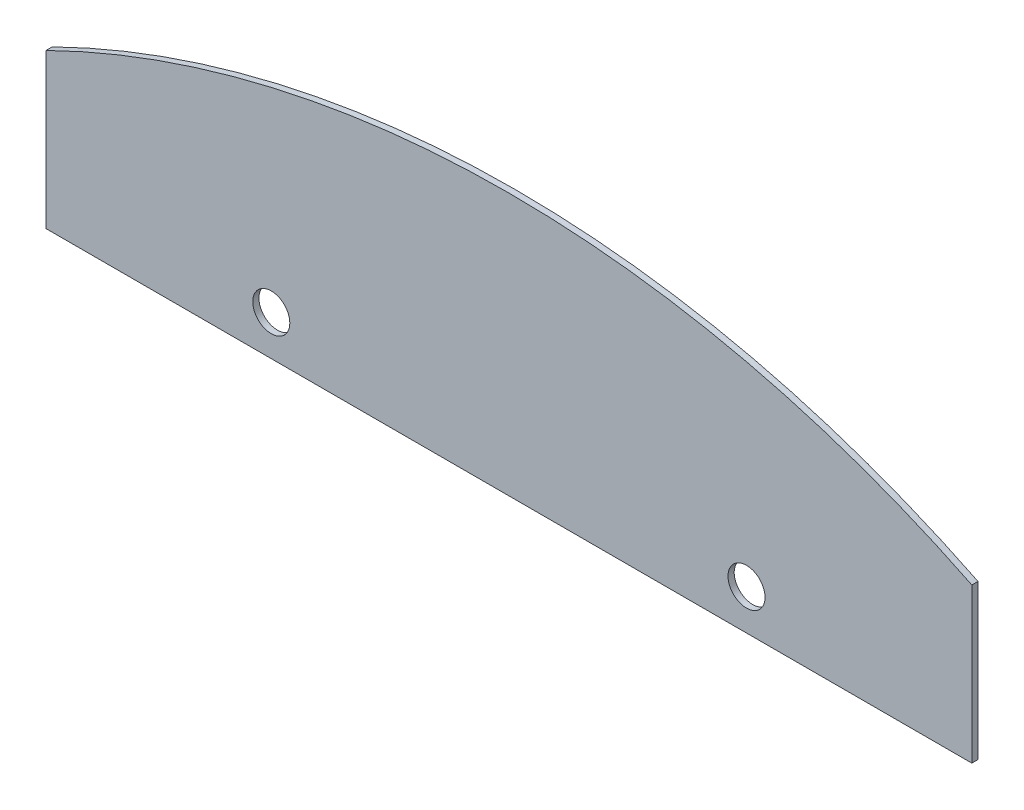
ISO-10303-21;
HEADER;
FILE_DESCRIPTION(('STEP AP214'),'2;1');
FILE_NAME('part.step','',(''),(''),'','','');
FILE_SCHEMA(('AUTOMOTIVE_DESIGN { 1 0 10303 214 1 1 1 1 }'));
ENDSEC;
DATA;
#1=APPLICATION_CONTEXT('core data for automotive mechanical design processes');
#2=APPLICATION_PROTOCOL_DEFINITION('international standard','automotive_design',2000,#1);
#3=PRODUCT_CONTEXT('',#1,'mechanical');
#4=PRODUCT('Part','Part','',(#3));
#5=PRODUCT_RELATED_PRODUCT_CATEGORY('part','',(#4));
#6=PRODUCT_DEFINITION_FORMATION('','',#4);
#7=PRODUCT_DEFINITION_CONTEXT('part definition',#1,'design');
#8=PRODUCT_DEFINITION('design','',#6,#7);
#9=PRODUCT_DEFINITION_SHAPE('','',#8);
#10=(LENGTH_UNIT() NAMED_UNIT(*) SI_UNIT(.MILLI.,.METRE.));
#11=(NAMED_UNIT(*) PLANE_ANGLE_UNIT() SI_UNIT($,.RADIAN.));
#12=(NAMED_UNIT(*) SI_UNIT($,.STERADIAN.) SOLID_ANGLE_UNIT());
#13=UNCERTAINTY_MEASURE_WITH_UNIT(LENGTH_MEASURE(1.E-05),#10,'distance_accuracy_value','');
#14=(GEOMETRIC_REPRESENTATION_CONTEXT(3) GLOBAL_UNCERTAINTY_ASSIGNED_CONTEXT((#13)) GLOBAL_UNIT_ASSIGNED_CONTEXT((#10,
#11,#12)) REPRESENTATION_CONTEXT('',''));
#15=CARTESIAN_POINT('',(0.,0.,0.));
#16=DIRECTION('',(0.,0.,1.));
#17=DIRECTION('',(1.,0.,0.));
#18=AXIS2_PLACEMENT_3D('',#15,#16,#17);
#19=CARTESIAN_POINT('',(-150.,0.,2.));
#20=DIRECTION('',(1.,0.,0.));
#21=DIRECTION('',(0.,0.,-1.));
#22=AXIS2_PLACEMENT_3D('',#19,#20,#21);
#23=PLANE('',#22);
#24=DIRECTION('',(0.,-1.,0.));
#25=VECTOR('',#24,1.);
#26=CARTESIAN_POINT('',(-150.,0.,0.));
#27=LINE('',#26,#25);
#28=CARTESIAN_POINT('',(-150.,49.9999999999999,0.));
#29=VERTEX_POINT('',#28);
#30=CARTESIAN_POINT('',(-150.,0.,0.));
#31=VERTEX_POINT('',#30);
#32=EDGE_CURVE('E113',#29,#31,#27,.T.);
#33=ORIENTED_EDGE('',*,*,#32,.T.);
#34=DIRECTION('',(0.,0.,-1.));
#35=VECTOR('',#34,1.);
#36=CARTESIAN_POINT('',(-150.,0.,2.));
#37=LINE('',#36,#35);
#38=CARTESIAN_POINT('',(-150.,0.,2.));
#39=VERTEX_POINT('',#38);
#40=EDGE_CURVE('E11',#39,#31,#37,.T.);
#41=ORIENTED_EDGE('',*,*,#40,.F.);
#42=DIRECTION('',(0.,-1.,0.));
#43=VECTOR('',#42,1.);
#44=CARTESIAN_POINT('',(-150.,0.,2.));
#45=LINE('',#44,#43);
#46=CARTESIAN_POINT('',(-150.,49.9999999999999,2.));
#47=VERTEX_POINT('',#46);
#48=EDGE_CURVE('E97',#47,#39,#45,.T.);
#49=ORIENTED_EDGE('',*,*,#48,.F.);
#50=DIRECTION('',(0.,0.,-1.));
#51=VECTOR('',#50,1.);
#52=CARTESIAN_POINT('',(-150.,49.9999999999999,2.));
#53=LINE('',#52,#51);
#54=EDGE_CURVE('E109',#47,#29,#53,.T.);
#55=ORIENTED_EDGE('',*,*,#54,.T.);
#56=EDGE_LOOP('',(#33,#41,#49,#55));
#57=FACE_BOUND('',#56,.T.);
#58=ADVANCED_FACE('F45',(#57),#23,.F.);
#59=CARTESIAN_POINT('',(-150.,0.,2.));
#60=DIRECTION('',(0.,1.,0.));
#61=DIRECTION('',(0.,0.,1.));
#62=AXIS2_PLACEMENT_3D('',#59,#60,#61);
#63=PLANE('',#62);
#64=DIRECTION('',(1.,0.,0.));
#65=VECTOR('',#64,1.);
#66=CARTESIAN_POINT('',(-150.,0.,0.));
#67=LINE('',#66,#65);
#68=CARTESIAN_POINT('',(150.,0.,0.));
#69=VERTEX_POINT('',#68);
#70=EDGE_CURVE('E102',#31,#69,#67,.T.);
#71=ORIENTED_EDGE('',*,*,#70,.T.);
#72=DIRECTION('',(0.,0.,-1.));
#73=VECTOR('',#72,1.);
#74=CARTESIAN_POINT('',(150.,0.,2.));
#75=LINE('',#74,#73);
#76=CARTESIAN_POINT('',(150.,0.,2.));
#77=VERTEX_POINT('',#76);
#78=EDGE_CURVE('E54',#77,#69,#75,.T.);
#79=ORIENTED_EDGE('',*,*,#78,.F.);
#80=DIRECTION('',(1.,0.,0.));
#81=VECTOR('',#80,1.);
#82=CARTESIAN_POINT('',(-150.,0.,2.));
#83=LINE('',#82,#81);
#84=EDGE_CURVE('E92',#39,#77,#83,.T.);
#85=ORIENTED_EDGE('',*,*,#84,.F.);
#86=ORIENTED_EDGE('',*,*,#40,.T.);
#87=EDGE_LOOP('',(#71,#79,#85,#86));
#88=FACE_BOUND('',#87,.T.);
#89=ADVANCED_FACE('F101',(#88),#63,.F.);
#90=CARTESIAN_POINT('',(150.,0.,2.));
#91=DIRECTION('',(-1.,0.,0.));
#92=DIRECTION('',(0.,0.,1.));
#93=AXIS2_PLACEMENT_3D('',#90,#91,#92);
#94=PLANE('',#93);
#95=DIRECTION('',(0.,1.,0.));
#96=VECTOR('',#95,1.);
#97=CARTESIAN_POINT('',(150.,0.,0.));
#98=LINE('',#97,#96);
#99=CARTESIAN_POINT('',(150.,50.,0.));
#100=VERTEX_POINT('',#99);
#101=EDGE_CURVE('E79',#69,#100,#98,.T.);
#102=ORIENTED_EDGE('',*,*,#101,.T.);
#103=DIRECTION('',(0.,0.,-1.));
#104=VECTOR('',#103,1.);
#105=CARTESIAN_POINT('',(150.,50.,2.));
#106=LINE('',#105,#104);
#107=CARTESIAN_POINT('',(150.,50.,2.));
#108=VERTEX_POINT('',#107);
#109=EDGE_CURVE('E104',#108,#100,#106,.T.);
#110=ORIENTED_EDGE('',*,*,#109,.F.);
#111=DIRECTION('',(0.,1.,0.));
#112=VECTOR('',#111,1.);
#113=CARTESIAN_POINT('',(150.,0.,2.));
#114=LINE('',#113,#112);
#115=EDGE_CURVE('E95',#77,#108,#114,.T.);
#116=ORIENTED_EDGE('',*,*,#115,.F.);
#117=ORIENTED_EDGE('',*,*,#78,.T.);
#118=EDGE_LOOP('',(#102,#110,#116,#117));
#119=FACE_BOUND('',#118,.T.);
#120=ADVANCED_FACE('F105',(#119),#94,.F.);
#121=CARTESIAN_POINT('',(0.,-253.928571428571,2.));
#122=DIRECTION('',(0.,0.,-1.));
#123=DIRECTION('',(-1.,0.,0.));
#124=AXIS2_PLACEMENT_3D('',#121,#122,#123);
#125=CYLINDRICAL_SURFACE('',#124,338.928571428571);
#126=CARTESIAN_POINT('',(0.,-253.928571428571,0.));
#127=DIRECTION('',(0.,0.,1.));
#128=DIRECTION('',(1.,0.,0.));
#129=AXIS2_PLACEMENT_3D('',#126,#127,#128);
#130=CIRCLE('',#129,338.928571428571);
#131=EDGE_CURVE('E85',#100,#29,#130,.T.);
#132=ORIENTED_EDGE('',*,*,#131,.T.);
#133=ORIENTED_EDGE('',*,*,#54,.F.);
#134=CARTESIAN_POINT('',(0.,-253.928571428571,2.));
#135=DIRECTION('',(0.,0.,1.));
#136=DIRECTION('',(1.,0.,0.));
#137=AXIS2_PLACEMENT_3D('',#134,#135,#136);
#138=CIRCLE('',#137,338.928571428571);
#139=EDGE_CURVE('E62',#108,#47,#138,.T.);
#140=ORIENTED_EDGE('',*,*,#139,.F.);
#141=ORIENTED_EDGE('',*,*,#109,.T.);
#142=EDGE_LOOP('',(#132,#133,#140,#141));
#143=FACE_BOUND('',#142,.T.);
#144=ADVANCED_FACE('F127',(#143),#125,.T.);
#145=CARTESIAN_POINT('',(0.,-253.928571428571,2.));
#146=DIRECTION('',(0.,0.,1.));
#147=DIRECTION('',(1.,0.,0.));
#148=AXIS2_PLACEMENT_3D('',#145,#146,#147);
#149=PLANE('',#148);
#150=CARTESIAN_POINT('',(-77.,13.,2.));
#151=DIRECTION('',(0.,0.,1.));
#152=DIRECTION('',(1.,0.,0.));
#153=AXIS2_PLACEMENT_3D('',#150,#151,#152);
#154=CIRCLE('',#153,6.00000000000002);
#155=CARTESIAN_POINT('',(-71.,13.,2.));
#156=VERTEX_POINT('',#155);
#157=EDGE_CURVE('E142',#156,#156,#154,.T.);
#158=ORIENTED_EDGE('',*,*,#157,.F.);
#159=EDGE_LOOP('',(#158));
#160=FACE_BOUND('',#159,.T.);
#161=CARTESIAN_POINT('',(77.,13.,2.));
#162=DIRECTION('',(0.,0.,1.));
#163=DIRECTION('',(1.,0.,0.));
#164=AXIS2_PLACEMENT_3D('',#161,#162,#163);
#165=CIRCLE('',#164,6.);
#166=CARTESIAN_POINT('',(83.,13.,2.));
#167=VERTEX_POINT('',#166);
#168=EDGE_CURVE('E138',#167,#167,#165,.T.);
#169=ORIENTED_EDGE('',*,*,#168,.F.);
#170=EDGE_LOOP('',(#169));
#171=FACE_BOUND('',#170,.T.);
#172=ORIENTED_EDGE('',*,*,#48,.T.);
#173=ORIENTED_EDGE('',*,*,#84,.T.);
#174=ORIENTED_EDGE('',*,*,#115,.T.);
#175=ORIENTED_EDGE('',*,*,#139,.T.);
#176=EDGE_LOOP('',(#172,#173,#174,#175));
#177=FACE_BOUND('',#176,.T.);
#178=ADVANCED_FACE('F93',(#160,#171,#177),#149,.T.);
#179=CARTESIAN_POINT('',(0.,-253.928571428571,0.));
#180=DIRECTION('',(0.,0.,1.));
#181=DIRECTION('',(1.,0.,0.));
#182=AXIS2_PLACEMENT_3D('',#179,#180,#181);
#183=PLANE('',#182);
#184=CARTESIAN_POINT('',(-77.,13.,0.));
#185=DIRECTION('',(0.,0.,1.));
#186=DIRECTION('',(1.,0.,0.));
#187=AXIS2_PLACEMENT_3D('',#184,#185,#186);
#188=CIRCLE('',#187,6.00000000000002);
#189=CARTESIAN_POINT('',(-71.,13.,0.));
#190=VERTEX_POINT('',#189);
#191=EDGE_CURVE('E117',#190,#190,#188,.T.);
#192=ORIENTED_EDGE('',*,*,#191,.T.);
#193=EDGE_LOOP('',(#192));
#194=FACE_BOUND('',#193,.T.);
#195=CARTESIAN_POINT('',(77.,13.,0.));
#196=DIRECTION('',(0.,0.,1.));
#197=DIRECTION('',(1.,0.,0.));
#198=AXIS2_PLACEMENT_3D('',#195,#196,#197);
#199=CIRCLE('',#198,6.);
#200=CARTESIAN_POINT('',(83.,13.,0.));
#201=VERTEX_POINT('',#200);
#202=EDGE_CURVE('E134',#201,#201,#199,.T.);
#203=ORIENTED_EDGE('',*,*,#202,.T.);
#204=EDGE_LOOP('',(#203));
#205=FACE_BOUND('',#204,.T.);
#206=ORIENTED_EDGE('',*,*,#32,.F.);
#207=ORIENTED_EDGE('',*,*,#131,.F.);
#208=ORIENTED_EDGE('',*,*,#101,.F.);
#209=ORIENTED_EDGE('',*,*,#70,.F.);
#210=EDGE_LOOP('',(#206,#207,#208,#209));
#211=FACE_BOUND('',#210,.T.);
#212=ADVANCED_FACE('F130',(#194,#205,#211),#183,.F.);
#213=CARTESIAN_POINT('',(77.,13.,0.));
#214=DIRECTION('',(0.,0.,1.));
#215=DIRECTION('',(1.,0.,0.));
#216=AXIS2_PLACEMENT_3D('',#213,#214,#215);
#217=CYLINDRICAL_SURFACE('',#216,6.);
#218=ORIENTED_EDGE('',*,*,#202,.F.);
#219=EDGE_LOOP('',(#218));
#220=FACE_BOUND('',#219,.T.);
#221=ORIENTED_EDGE('',*,*,#168,.T.);
#222=EDGE_LOOP('',(#221));
#223=FACE_BOUND('',#222,.T.);
#224=ADVANCED_FACE('F155',(#220,#223),#217,.F.);
#225=CARTESIAN_POINT('',(-77.,13.,0.));
#226=DIRECTION('',(0.,0.,1.));
#227=DIRECTION('',(1.,0.,0.));
#228=AXIS2_PLACEMENT_3D('',#225,#226,#227);
#229=CYLINDRICAL_SURFACE('',#228,6.00000000000002);
#230=ORIENTED_EDGE('',*,*,#191,.F.);
#231=EDGE_LOOP('',(#230));
#232=FACE_BOUND('',#231,.T.);
#233=ORIENTED_EDGE('',*,*,#157,.T.);
#234=EDGE_LOOP('',(#233));
#235=FACE_BOUND('',#234,.T.);
#236=ADVANCED_FACE('F152',(#232,#235),#229,.F.);
#237=CLOSED_SHELL('',(#58,#89,#120,#144,#178,#212,#224,#236));
#238=MANIFOLD_SOLID_BREP('B2',#237);
#239=ADVANCED_BREP_SHAPE_REPRESENTATION('',(#18,#238),#14);
#240=SHAPE_DEFINITION_REPRESENTATION(#9,#239);
ENDSEC;
END-ISO-10303-21;
